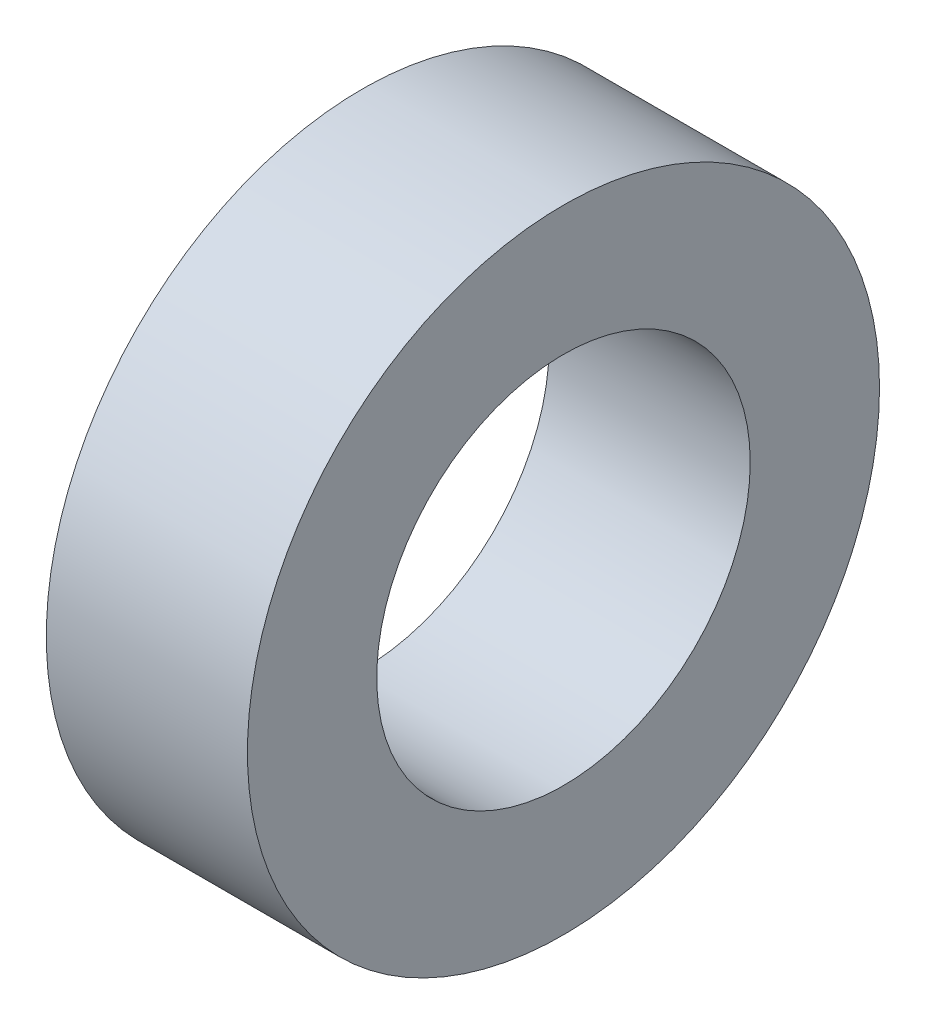
ISO-10303-21;
HEADER;
FILE_DESCRIPTION(('STEP AP214'),'2;1');
FILE_NAME('part.step','',(''),(''),'','','');
FILE_SCHEMA(('AUTOMOTIVE_DESIGN { 1 0 10303 214 1 1 1 1 }'));
ENDSEC;
DATA;
#1=APPLICATION_CONTEXT('core data for automotive mechanical design processes');
#2=APPLICATION_PROTOCOL_DEFINITION('international standard','automotive_design',2000,#1);
#3=PRODUCT_CONTEXT('',#1,'mechanical');
#4=PRODUCT('Part','Part','',(#3));
#5=PRODUCT_RELATED_PRODUCT_CATEGORY('part','',(#4));
#6=PRODUCT_DEFINITION_FORMATION('','',#4);
#7=PRODUCT_DEFINITION_CONTEXT('part definition',#1,'design');
#8=PRODUCT_DEFINITION('design','',#6,#7);
#9=PRODUCT_DEFINITION_SHAPE('','',#8);
#10=(LENGTH_UNIT() NAMED_UNIT(*) SI_UNIT(.MILLI.,.METRE.));
#11=(NAMED_UNIT(*) PLANE_ANGLE_UNIT() SI_UNIT($,.RADIAN.));
#12=(NAMED_UNIT(*) SI_UNIT($,.STERADIAN.) SOLID_ANGLE_UNIT());
#13=UNCERTAINTY_MEASURE_WITH_UNIT(LENGTH_MEASURE(1.E-05),#10,'distance_accuracy_value','');
#14=(GEOMETRIC_REPRESENTATION_CONTEXT(3) GLOBAL_UNCERTAINTY_ASSIGNED_CONTEXT((#13)) GLOBAL_UNIT_ASSIGNED_CONTEXT((#10,
#11,#12)) REPRESENTATION_CONTEXT('',''));
#15=CARTESIAN_POINT('',(0.,0.,0.));
#16=DIRECTION('',(0.,0.,1.));
#17=DIRECTION('',(1.,0.,0.));
#18=AXIS2_PLACEMENT_3D('',#15,#16,#17);
#19=CARTESIAN_POINT('',(7.,0.,0.));
#20=DIRECTION('',(1.,0.,0.));
#21=DIRECTION('',(0.,0.,-1.));
#22=AXIS2_PLACEMENT_3D('',#19,#20,#21);
#23=PLANE('',#22);
#24=CARTESIAN_POINT('',(7.,0.,0.));
#25=DIRECTION('',(1.,0.,0.));
#26=DIRECTION('',(0.,0.,-1.));
#27=AXIS2_PLACEMENT_3D('',#24,#25,#26);
#28=CIRCLE('',#27,11.);
#29=CARTESIAN_POINT('',(7.,0.,-11.));
#30=VERTEX_POINT('',#29);
#31=EDGE_CURVE('E10',#30,#30,#28,.T.);
#32=ORIENTED_EDGE('',*,*,#31,.T.);
#33=EDGE_LOOP('',(#32));
#34=FACE_BOUND('',#33,.T.);
#35=CARTESIAN_POINT('',(7.,0.,0.));
#36=DIRECTION('',(1.,0.,0.));
#37=DIRECTION('',(0.,0.,-1.));
#38=AXIS2_PLACEMENT_3D('',#35,#36,#37);
#39=CIRCLE('',#38,6.5);
#40=CARTESIAN_POINT('',(7.,0.,-6.5));
#41=VERTEX_POINT('',#40);
#42=EDGE_CURVE('E44',#41,#41,#39,.T.);
#43=ORIENTED_EDGE('',*,*,#42,.F.);
#44=EDGE_LOOP('',(#43));
#45=FACE_BOUND('',#44,.T.);
#46=ADVANCED_FACE('F33',(#34,#45),#23,.T.);
#47=CARTESIAN_POINT('',(0.,0.,0.));
#48=DIRECTION('',(1.,0.,0.));
#49=DIRECTION('',(0.,0.,-1.));
#50=AXIS2_PLACEMENT_3D('',#47,#48,#49);
#51=PLANE('',#50);
#52=CARTESIAN_POINT('',(0.,0.,0.));
#53=DIRECTION('',(1.,0.,0.));
#54=DIRECTION('',(0.,0.,-1.));
#55=AXIS2_PLACEMENT_3D('',#52,#53,#54);
#56=CIRCLE('',#55,11.);
#57=CARTESIAN_POINT('',(0.,0.,-11.));
#58=VERTEX_POINT('',#57);
#59=EDGE_CURVE('E37',#58,#58,#56,.T.);
#60=ORIENTED_EDGE('',*,*,#59,.F.);
#61=EDGE_LOOP('',(#60));
#62=FACE_BOUND('',#61,.T.);
#63=CARTESIAN_POINT('',(0.,0.,0.));
#64=DIRECTION('',(1.,0.,0.));
#65=DIRECTION('',(0.,0.,-1.));
#66=AXIS2_PLACEMENT_3D('',#63,#64,#65);
#67=CIRCLE('',#66,6.5);
#68=CARTESIAN_POINT('',(0.,0.,-6.5));
#69=VERTEX_POINT('',#68);
#70=EDGE_CURVE('E46',#69,#69,#67,.T.);
#71=ORIENTED_EDGE('',*,*,#70,.T.);
#72=EDGE_LOOP('',(#71));
#73=FACE_BOUND('',#72,.T.);
#74=ADVANCED_FACE('F56',(#62,#73),#51,.F.);
#75=CARTESIAN_POINT('',(7.,0.,0.));
#76=DIRECTION('',(-1.,0.,0.));
#77=DIRECTION('',(0.,0.,1.));
#78=AXIS2_PLACEMENT_3D('',#75,#76,#77);
#79=CYLINDRICAL_SURFACE('',#78,11.);
#80=ORIENTED_EDGE('',*,*,#31,.F.);
#81=EDGE_LOOP('',(#80));
#82=FACE_BOUND('',#81,.T.);
#83=ORIENTED_EDGE('',*,*,#59,.T.);
#84=EDGE_LOOP('',(#83));
#85=FACE_BOUND('',#84,.T.);
#86=ADVANCED_FACE('F35',(#82,#85),#79,.T.);
#87=CARTESIAN_POINT('',(7.,0.,0.));
#88=DIRECTION('',(-1.,0.,0.));
#89=DIRECTION('',(0.,0.,1.));
#90=AXIS2_PLACEMENT_3D('',#87,#88,#89);
#91=CYLINDRICAL_SURFACE('',#90,6.5);
#92=ORIENTED_EDGE('',*,*,#42,.T.);
#93=EDGE_LOOP('',(#92));
#94=FACE_BOUND('',#93,.T.);
#95=ORIENTED_EDGE('',*,*,#70,.F.);
#96=EDGE_LOOP('',(#95));
#97=FACE_BOUND('',#96,.T.);
#98=ADVANCED_FACE('F52',(#94,#97),#91,.F.);
#99=CLOSED_SHELL('',(#46,#74,#86,#98));
#100=MANIFOLD_SOLID_BREP('B2',#99);
#101=ADVANCED_BREP_SHAPE_REPRESENTATION('',(#18,#100),#14);
#102=SHAPE_DEFINITION_REPRESENTATION(#9,#101);
ENDSEC;
END-ISO-10303-21;
